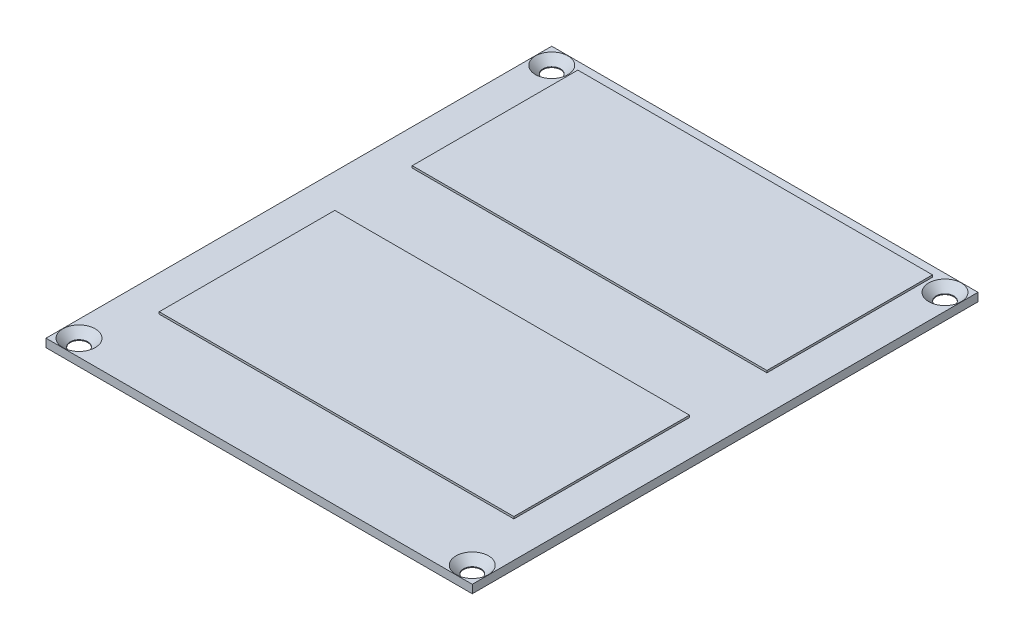
ISO-10303-21;
HEADER;
FILE_DESCRIPTION(('STEP AP214'),'2;1');
FILE_NAME('part.step','',(''),(''),'','','');
FILE_SCHEMA(('AUTOMOTIVE_DESIGN { 1 0 10303 214 1 1 1 1 }'));
ENDSEC;
DATA;
#1=APPLICATION_CONTEXT('core data for automotive mechanical design processes');
#2=APPLICATION_PROTOCOL_DEFINITION('international standard','automotive_design',2000,#1);
#3=PRODUCT_CONTEXT('',#1,'mechanical');
#4=PRODUCT('Part','Part','',(#3));
#5=PRODUCT_RELATED_PRODUCT_CATEGORY('part','',(#4));
#6=PRODUCT_DEFINITION_FORMATION('','',#4);
#7=PRODUCT_DEFINITION_CONTEXT('part definition',#1,'design');
#8=PRODUCT_DEFINITION('design','',#6,#7);
#9=PRODUCT_DEFINITION_SHAPE('','',#8);
#10=(LENGTH_UNIT() NAMED_UNIT(*) SI_UNIT(.MILLI.,.METRE.));
#11=(NAMED_UNIT(*) PLANE_ANGLE_UNIT() SI_UNIT($,.RADIAN.));
#12=(NAMED_UNIT(*) SI_UNIT($,.STERADIAN.) SOLID_ANGLE_UNIT());
#13=UNCERTAINTY_MEASURE_WITH_UNIT(LENGTH_MEASURE(1.E-05),#10,'distance_accuracy_value','');
#14=(GEOMETRIC_REPRESENTATION_CONTEXT(3) GLOBAL_UNCERTAINTY_ASSIGNED_CONTEXT((#13)) GLOBAL_UNIT_ASSIGNED_CONTEXT((#10,
#11,#12)) REPRESENTATION_CONTEXT('',''));
#15=CARTESIAN_POINT('',(0.,0.,0.));
#16=DIRECTION('',(0.,0.,1.));
#17=DIRECTION('',(1.,0.,0.));
#18=AXIS2_PLACEMENT_3D('',#15,#16,#17);
#19=CARTESIAN_POINT('',(0.,1.6,0.));
#20=DIRECTION('',(0.,1.,0.));
#21=DIRECTION('',(0.,0.,1.));
#22=AXIS2_PLACEMENT_3D('',#19,#20,#21);
#23=PLANE('',#22);
#24=CARTESIAN_POINT('',(-38.1,1.6,-45.8));
#25=DIRECTION('',(0.,1.,0.));
#26=DIRECTION('',(0.,0.,1.));
#27=AXIS2_PLACEMENT_3D('',#24,#25,#26);
#28=CIRCLE('',#27,3.15);
#29=CARTESIAN_POINT('',(-38.1,1.6,-42.65));
#30=VERTEX_POINT('',#29);
#31=EDGE_CURVE('E809',#30,#30,#28,.T.);
#32=ORIENTED_EDGE('',*,*,#31,.F.);
#33=EDGE_LOOP('',(#32));
#34=FACE_BOUND('',#33,.T.);
#35=CARTESIAN_POINT('',(38.1,1.6,-45.8));
#36=DIRECTION('',(0.,1.,0.));
#37=DIRECTION('',(0.,0.,1.));
#38=AXIS2_PLACEMENT_3D('',#35,#36,#37);
#39=CIRCLE('',#38,3.15);
#40=CARTESIAN_POINT('',(38.1,1.6,-42.65));
#41=VERTEX_POINT('',#40);
#42=EDGE_CURVE('E394',#41,#41,#39,.T.);
#43=ORIENTED_EDGE('',*,*,#42,.F.);
#44=EDGE_LOOP('',(#43));
#45=FACE_BOUND('',#44,.T.);
#46=CARTESIAN_POINT('',(38.1,1.6,45.8));
#47=DIRECTION('',(0.,1.,0.));
#48=DIRECTION('',(0.,0.,1.));
#49=AXIS2_PLACEMENT_3D('',#46,#47,#48);
#50=CIRCLE('',#49,3.15);
#51=CARTESIAN_POINT('',(38.1,1.6,48.95));
#52=VERTEX_POINT('',#51);
#53=EDGE_CURVE('E387',#52,#52,#50,.T.);
#54=ORIENTED_EDGE('',*,*,#53,.F.);
#55=EDGE_LOOP('',(#54));
#56=FACE_BOUND('',#55,.T.);
#57=CARTESIAN_POINT('',(-38.1,1.6,45.8));
#58=DIRECTION('',(0.,1.,0.));
#59=DIRECTION('',(0.,0.,1.));
#60=AXIS2_PLACEMENT_3D('',#57,#58,#59);
#61=CIRCLE('',#60,3.15);
#62=CARTESIAN_POINT('',(-38.1,1.6,48.95));
#63=VERTEX_POINT('',#62);
#64=EDGE_CURVE('E383',#63,#63,#61,.T.);
#65=ORIENTED_EDGE('',*,*,#64,.F.);
#66=EDGE_LOOP('',(#65));
#67=FACE_BOUND('',#66,.T.);
#68=DIRECTION('',(0.,0.,1.));
#69=VECTOR('',#68,1.);
#70=CARTESIAN_POINT('',(41.3,1.6,0.));
#71=LINE('',#70,#69);
#72=CARTESIAN_POINT('',(41.3,1.6,-49.));
#73=VERTEX_POINT('',#72);
#74=CARTESIAN_POINT('',(41.3,1.6,49.));
#75=VERTEX_POINT('',#74);
#76=EDGE_CURVE('E349',#73,#75,#71,.T.);
#77=ORIENTED_EDGE('',*,*,#76,.F.);
#78=DIRECTION('',(1.,0.,0.));
#79=VECTOR('',#78,1.);
#80=CARTESIAN_POINT('',(0.,1.6,-49.));
#81=LINE('',#80,#79);
#82=CARTESIAN_POINT('',(-41.3,1.6,-49.));
#83=VERTEX_POINT('',#82);
#84=EDGE_CURVE('E352',#83,#73,#81,.T.);
#85=ORIENTED_EDGE('',*,*,#84,.F.);
#86=DIRECTION('',(0.,0.,1.));
#87=VECTOR('',#86,1.);
#88=CARTESIAN_POINT('',(-41.3,1.6,0.));
#89=LINE('',#88,#87);
#90=CARTESIAN_POINT('',(-41.3,1.6,49.));
#91=VERTEX_POINT('',#90);
#92=EDGE_CURVE('E356',#83,#91,#89,.T.);
#93=ORIENTED_EDGE('',*,*,#92,.T.);
#94=DIRECTION('',(1.,0.,0.));
#95=VECTOR('',#94,1.);
#96=CARTESIAN_POINT('',(0.,1.6,49.));
#97=LINE('',#96,#95);
#98=EDGE_CURVE('E359',#91,#75,#97,.T.);
#99=ORIENTED_EDGE('',*,*,#98,.T.);
#100=EDGE_LOOP('',(#77,#85,#93,#99));
#101=FACE_BOUND('',#100,.T.);
#102=DIRECTION('',(-1.,0.,0.));
#103=VECTOR('',#102,1.);
#104=CARTESIAN_POINT('',(-34.3646542912737,1.6,-47.1195444965869));
#105=LINE('',#104,#103);
#106=CARTESIAN_POINT('',(34.3646542912737,1.6,-47.1195444965869));
#107=VERTEX_POINT('',#106);
#108=CARTESIAN_POINT('',(-34.3646542912737,1.6,-47.1195444965869));
#109=VERTEX_POINT('',#108);
#110=EDGE_CURVE('E224',#107,#109,#105,.T.);
#111=ORIENTED_EDGE('',*,*,#110,.F.);
#112=DIRECTION('',(0.,0.,-1.));
#113=VECTOR('',#112,1.);
#114=CARTESIAN_POINT('',(34.3646542912737,1.6,-47.1195444965869));
#115=LINE('',#114,#113);
#116=CARTESIAN_POINT('',(34.3646542912737,1.6,-15.0294090613042));
#117=VERTEX_POINT('',#116);
#118=EDGE_CURVE('E221',#117,#107,#115,.T.);
#119=ORIENTED_EDGE('',*,*,#118,.F.);
#120=DIRECTION('',(1.,0.,0.));
#121=VECTOR('',#120,1.);
#122=CARTESIAN_POINT('',(-34.3646542912737,1.6,-15.0294090613042));
#123=LINE('',#122,#121);
#124=CARTESIAN_POINT('',(-34.3646542912737,1.6,-15.0294090613042));
#125=VERTEX_POINT('',#124);
#126=EDGE_CURVE('E233',#125,#117,#123,.T.);
#127=ORIENTED_EDGE('',*,*,#126,.F.);
#128=DIRECTION('',(0.,0.,1.));
#129=VECTOR('',#128,1.);
#130=CARTESIAN_POINT('',(-34.3646542912737,1.6,-47.1195444965869));
#131=LINE('',#130,#129);
#132=EDGE_CURVE('E241',#109,#125,#131,.T.);
#133=ORIENTED_EDGE('',*,*,#132,.F.);
#134=EDGE_LOOP('',(#111,#119,#127,#133));
#135=FACE_BOUND('',#134,.T.);
#136=DIRECTION('',(-1.,0.,0.));
#137=VECTOR('',#136,1.);
#138=CARTESIAN_POINT('',(-34.3646542912737,1.6,-0.0294090613042267));
#139=LINE('',#138,#137);
#140=CARTESIAN_POINT('',(34.3646542912737,1.6,-0.0294090613042267));
#141=VERTEX_POINT('',#140);
#142=CARTESIAN_POINT('',(-34.3646542912737,1.6,-0.0294090613042267));
#143=VERTEX_POINT('',#142);
#144=EDGE_CURVE('E412',#141,#143,#139,.T.);
#145=ORIENTED_EDGE('',*,*,#144,.F.);
#146=DIRECTION('',(0.,0.,-1.));
#147=VECTOR('',#146,1.);
#148=CARTESIAN_POINT('',(34.3646542912737,1.6,-0.0294090613042267));
#149=LINE('',#148,#147);
#150=CARTESIAN_POINT('',(34.3646542912737,1.6,34.));
#151=VERTEX_POINT('',#150);
#152=EDGE_CURVE('E219',#151,#141,#149,.T.);
#153=ORIENTED_EDGE('',*,*,#152,.F.);
#154=DIRECTION('',(1.,0.,0.));
#155=VECTOR('',#154,1.);
#156=CARTESIAN_POINT('',(-34.3646542912737,1.6,34.));
#157=LINE('',#156,#155);
#158=CARTESIAN_POINT('',(-34.3646542912737,1.6,34.));
#159=VERTEX_POINT('',#158);
#160=EDGE_CURVE('E215',#159,#151,#157,.T.);
#161=ORIENTED_EDGE('',*,*,#160,.F.);
#162=DIRECTION('',(0.,0.,1.));
#163=VECTOR('',#162,1.);
#164=CARTESIAN_POINT('',(-34.3646542912737,1.6,-0.0294090613042267));
#165=LINE('',#164,#163);
#166=EDGE_CURVE('E414',#143,#159,#165,.T.);
#167=ORIENTED_EDGE('',*,*,#166,.F.);
#168=EDGE_LOOP('',(#145,#153,#161,#167));
#169=FACE_BOUND('',#168,.T.);
#170=ADVANCED_FACE('F33',(#34,#45,#56,#67,#101,#135,#169),#23,.T.);
#171=CARTESIAN_POINT('',(0.,0.,0.));
#172=DIRECTION('',(0.,1.,0.));
#173=DIRECTION('',(0.,0.,1.));
#174=AXIS2_PLACEMENT_3D('',#171,#172,#173);
#175=PLANE('',#174);
#176=CARTESIAN_POINT('',(-38.1,0.,-45.8));
#177=DIRECTION('',(0.,1.,0.));
#178=DIRECTION('',(0.,0.,1.));
#179=AXIS2_PLACEMENT_3D('',#176,#177,#178);
#180=CIRCLE('',#179,1.7);
#181=CARTESIAN_POINT('',(-38.1,0.,-44.1));
#182=VERTEX_POINT('',#181);
#183=EDGE_CURVE('E37',#182,#182,#180,.T.);
#184=ORIENTED_EDGE('',*,*,#183,.T.);
#185=EDGE_LOOP('',(#184));
#186=FACE_BOUND('',#185,.T.);
#187=CARTESIAN_POINT('',(38.1,0.,-45.8));
#188=DIRECTION('',(0.,1.,0.));
#189=DIRECTION('',(0.,0.,1.));
#190=AXIS2_PLACEMENT_3D('',#187,#188,#189);
#191=CIRCLE('',#190,1.7);
#192=CARTESIAN_POINT('',(38.1,0.,-44.1));
#193=VERTEX_POINT('',#192);
#194=EDGE_CURVE('E385',#193,#193,#191,.T.);
#195=ORIENTED_EDGE('',*,*,#194,.T.);
#196=EDGE_LOOP('',(#195));
#197=FACE_BOUND('',#196,.T.);
#198=CARTESIAN_POINT('',(38.1,0.,45.8));
#199=DIRECTION('',(0.,1.,0.));
#200=DIRECTION('',(0.,0.,1.));
#201=AXIS2_PLACEMENT_3D('',#198,#199,#200);
#202=CIRCLE('',#201,1.7);
#203=CARTESIAN_POINT('',(38.1,0.,47.5));
#204=VERTEX_POINT('',#203);
#205=EDGE_CURVE('E381',#204,#204,#202,.T.);
#206=ORIENTED_EDGE('',*,*,#205,.T.);
#207=EDGE_LOOP('',(#206));
#208=FACE_BOUND('',#207,.T.);
#209=CARTESIAN_POINT('',(-38.1,0.,45.8));
#210=DIRECTION('',(0.,1.,0.));
#211=DIRECTION('',(0.,0.,1.));
#212=AXIS2_PLACEMENT_3D('',#209,#210,#211);
#213=CIRCLE('',#212,1.7);
#214=CARTESIAN_POINT('',(-38.1,0.,47.5));
#215=VERTEX_POINT('',#214);
#216=EDGE_CURVE('E377',#215,#215,#213,.T.);
#217=ORIENTED_EDGE('',*,*,#216,.T.);
#218=EDGE_LOOP('',(#217));
#219=FACE_BOUND('',#218,.T.);
#220=DIRECTION('',(0.,0.,1.));
#221=VECTOR('',#220,1.);
#222=CARTESIAN_POINT('',(24.1,0.,0.));
#223=LINE('',#222,#221);
#224=CARTESIAN_POINT('',(24.1,0.,31.));
#225=VERTEX_POINT('',#224);
#226=CARTESIAN_POINT('',(24.1,0.,34.7));
#227=VERTEX_POINT('',#226);
#228=EDGE_CURVE('E276',#225,#227,#223,.T.);
#229=ORIENTED_EDGE('',*,*,#228,.F.);
#230=DIRECTION('',(1.,0.,0.));
#231=VECTOR('',#230,1.);
#232=CARTESIAN_POINT('',(0.,0.,31.));
#233=LINE('',#232,#231);
#234=CARTESIAN_POINT('',(8.51084598698482,0.,31.));
#235=VERTEX_POINT('',#234);
#236=EDGE_CURVE('E299',#235,#225,#233,.T.);
#237=ORIENTED_EDGE('',*,*,#236,.F.);
#238=DIRECTION('',(0.,0.,1.));
#239=VECTOR('',#238,1.);
#240=CARTESIAN_POINT('',(8.51084598698482,0.,0.));
#241=LINE('',#240,#239);
#242=CARTESIAN_POINT('',(8.51084598698482,0.,34.7));
#243=VERTEX_POINT('',#242);
#244=EDGE_CURVE('E302',#235,#243,#241,.T.);
#245=ORIENTED_EDGE('',*,*,#244,.T.);
#246=DIRECTION('',(1.,0.,0.));
#247=VECTOR('',#246,1.);
#248=CARTESIAN_POINT('',(0.,0.,34.7));
#249=LINE('',#248,#247);
#250=EDGE_CURVE('E288',#243,#227,#249,.T.);
#251=ORIENTED_EDGE('',*,*,#250,.T.);
#252=EDGE_LOOP('',(#229,#237,#245,#251));
#253=FACE_BOUND('',#252,.T.);
#254=DIRECTION('',(0.,0.,1.));
#255=VECTOR('',#254,1.);
#256=CARTESIAN_POINT('',(41.3,0.,0.));
#257=LINE('',#256,#255);
#258=CARTESIAN_POINT('',(41.3,0.,-49.));
#259=VERTEX_POINT('',#258);
#260=CARTESIAN_POINT('',(41.3,0.,49.));
#261=VERTEX_POINT('',#260);
#262=EDGE_CURVE('E340',#259,#261,#257,.T.);
#263=ORIENTED_EDGE('',*,*,#262,.T.);
#264=DIRECTION('',(1.,0.,0.));
#265=VECTOR('',#264,1.);
#266=CARTESIAN_POINT('',(0.,0.,49.));
#267=LINE('',#266,#265);
#268=CARTESIAN_POINT('',(-41.3,0.,49.));
#269=VERTEX_POINT('',#268);
#270=EDGE_CURVE('E353',#269,#261,#267,.T.);
#271=ORIENTED_EDGE('',*,*,#270,.F.);
#272=DIRECTION('',(0.,0.,1.));
#273=VECTOR('',#272,1.);
#274=CARTESIAN_POINT('',(-41.3,0.,0.));
#275=LINE('',#274,#273);
#276=CARTESIAN_POINT('',(-41.3,0.,-49.));
#277=VERTEX_POINT('',#276);
#278=EDGE_CURVE('E367',#277,#269,#275,.T.);
#279=ORIENTED_EDGE('',*,*,#278,.F.);
#280=DIRECTION('',(1.,0.,0.));
#281=VECTOR('',#280,1.);
#282=CARTESIAN_POINT('',(0.,0.,-49.));
#283=LINE('',#282,#281);
#284=EDGE_CURVE('E364',#277,#259,#283,.T.);
#285=ORIENTED_EDGE('',*,*,#284,.T.);
#286=EDGE_LOOP('',(#263,#271,#279,#285));
#287=FACE_BOUND('',#286,.T.);
#288=DIRECTION('',(0.,0.,1.));
#289=VECTOR('',#288,1.);
#290=CARTESIAN_POINT('',(24.1,0.,0.));
#291=LINE('',#290,#289);
#292=CARTESIAN_POINT('',(24.1,0.,36.2));
#293=VERTEX_POINT('',#292);
#294=CARTESIAN_POINT('',(24.1,0.,39.9));
#295=VERTEX_POINT('',#294);
#296=EDGE_CURVE('E308',#293,#295,#291,.T.);
#297=ORIENTED_EDGE('',*,*,#296,.F.);
#298=DIRECTION('',(1.,0.,0.));
#299=VECTOR('',#298,1.);
#300=CARTESIAN_POINT('',(0.,0.,36.2));
#301=LINE('',#300,#299);
#302=CARTESIAN_POINT('',(6.42733188720174,0.,36.2));
#303=VERTEX_POINT('',#302);
#304=EDGE_CURVE('E331',#303,#293,#301,.T.);
#305=ORIENTED_EDGE('',*,*,#304,.F.);
#306=DIRECTION('',(0.,0.,1.));
#307=VECTOR('',#306,1.);
#308=CARTESIAN_POINT('',(6.42733188720174,0.,0.));
#309=LINE('',#308,#307);
#310=CARTESIAN_POINT('',(6.42733188720174,0.,39.9));
#311=VERTEX_POINT('',#310);
#312=EDGE_CURVE('E334',#303,#311,#309,.T.);
#313=ORIENTED_EDGE('',*,*,#312,.T.);
#314=DIRECTION('',(1.,0.,0.));
#315=VECTOR('',#314,1.);
#316=CARTESIAN_POINT('',(0.,0.,39.9));
#317=LINE('',#316,#315);
#318=EDGE_CURVE('E320',#311,#295,#317,.T.);
#319=ORIENTED_EDGE('',*,*,#318,.T.);
#320=EDGE_LOOP('',(#297,#305,#313,#319));
#321=FACE_BOUND('',#320,.T.);
#322=DIRECTION('',(0.,0.,1.));
#323=VECTOR('',#322,1.);
#324=CARTESIAN_POINT('',(4.92733188720173,0.,0.));
#325=LINE('',#324,#323);
#326=CARTESIAN_POINT('',(4.92733188720174,0.,36.2));
#327=VERTEX_POINT('',#326);
#328=CARTESIAN_POINT('',(4.92733188720174,0.,39.9));
#329=VERTEX_POINT('',#328);
#330=EDGE_CURVE('E252',#327,#329,#325,.T.);
#331=ORIENTED_EDGE('',*,*,#330,.F.);
#332=DIRECTION('',(1.,0.,0.));
#333=VECTOR('',#332,1.);
#334=CARTESIAN_POINT('',(0.,0.,36.2));
#335=LINE('',#334,#333);
#336=CARTESIAN_POINT('',(-14.8726681127983,0.,36.2));
#337=VERTEX_POINT('',#336);
#338=EDGE_CURVE('E267',#337,#327,#335,.T.);
#339=ORIENTED_EDGE('',*,*,#338,.F.);
#340=DIRECTION('',(0.,0.,1.));
#341=VECTOR('',#340,1.);
#342=CARTESIAN_POINT('',(-14.8726681127983,0.,0.));
#343=LINE('',#342,#341);
#344=CARTESIAN_POINT('',(-14.8726681127983,0.,39.9));
#345=VERTEX_POINT('',#344);
#346=EDGE_CURVE('E270',#337,#345,#343,.T.);
#347=ORIENTED_EDGE('',*,*,#346,.T.);
#348=DIRECTION('',(1.,0.,0.));
#349=VECTOR('',#348,1.);
#350=CARTESIAN_POINT('',(0.,0.,39.9));
#351=LINE('',#350,#349);
#352=EDGE_CURVE('E256',#345,#329,#351,.T.);
#353=ORIENTED_EDGE('',*,*,#352,.T.);
#354=EDGE_LOOP('',(#331,#339,#347,#353));
#355=FACE_BOUND('',#354,.T.);
#356=ADVANCED_FACE('F433',(#186,#197,#208,#219,#253,#287,#321,#355),#175,.F.);
#357=CARTESIAN_POINT('',(41.3,1.6,0.));
#358=DIRECTION('',(1.,0.,0.));
#359=DIRECTION('',(0.,0.,-1.));
#360=AXIS2_PLACEMENT_3D('',#357,#358,#359);
#361=PLANE('',#360);
#362=ORIENTED_EDGE('',*,*,#262,.F.);
#363=DIRECTION('',(0.,-1.,0.));
#364=VECTOR('',#363,1.);
#365=CARTESIAN_POINT('',(41.3,1.6,-49.));
#366=LINE('',#365,#364);
#367=EDGE_CURVE('E11',#73,#259,#366,.T.);
#368=ORIENTED_EDGE('',*,*,#367,.F.);
#369=ORIENTED_EDGE('',*,*,#76,.T.);
#370=DIRECTION('',(0.,-1.,0.));
#371=VECTOR('',#370,1.);
#372=CARTESIAN_POINT('',(41.3,1.6,49.));
#373=LINE('',#372,#371);
#374=EDGE_CURVE('E361',#75,#261,#373,.T.);
#375=ORIENTED_EDGE('',*,*,#374,.T.);
#376=EDGE_LOOP('',(#362,#368,#369,#375));
#377=FACE_BOUND('',#376,.T.);
#378=ADVANCED_FACE('F35',(#377),#361,.T.);
#379=CARTESIAN_POINT('',(0.,1.6,-49.));
#380=DIRECTION('',(0.,0.,-1.));
#381=DIRECTION('',(-1.,0.,0.));
#382=AXIS2_PLACEMENT_3D('',#379,#380,#381);
#383=PLANE('',#382);
#384=ORIENTED_EDGE('',*,*,#284,.F.);
#385=DIRECTION('',(0.,-1.,0.));
#386=VECTOR('',#385,1.);
#387=CARTESIAN_POINT('',(-41.3,1.6,-49.));
#388=LINE('',#387,#386);
#389=EDGE_CURVE('E42',#83,#277,#388,.T.);
#390=ORIENTED_EDGE('',*,*,#389,.F.);
#391=ORIENTED_EDGE('',*,*,#84,.T.);
#392=ORIENTED_EDGE('',*,*,#367,.T.);
#393=EDGE_LOOP('',(#384,#390,#391,#392));
#394=FACE_BOUND('',#393,.T.);
#395=ADVANCED_FACE('F454',(#394),#383,.T.);
#396=CARTESIAN_POINT('',(-41.3,1.6,0.));
#397=DIRECTION('',(1.,0.,0.));
#398=DIRECTION('',(0.,0.,-1.));
#399=AXIS2_PLACEMENT_3D('',#396,#397,#398);
#400=PLANE('',#399);
#401=ORIENTED_EDGE('',*,*,#278,.T.);
#402=DIRECTION('',(0.,-1.,0.));
#403=VECTOR('',#402,1.);
#404=CARTESIAN_POINT('',(-41.3,1.6,49.));
#405=LINE('',#404,#403);
#406=EDGE_CURVE('E373',#91,#269,#405,.T.);
#407=ORIENTED_EDGE('',*,*,#406,.F.);
#408=ORIENTED_EDGE('',*,*,#92,.F.);
#409=ORIENTED_EDGE('',*,*,#389,.T.);
#410=EDGE_LOOP('',(#401,#407,#408,#409));
#411=FACE_BOUND('',#410,.T.);
#412=ADVANCED_FACE('F451',(#411),#400,.F.);
#413=CARTESIAN_POINT('',(0.,1.6,49.));
#414=DIRECTION('',(0.,0.,-1.));
#415=DIRECTION('',(-1.,0.,0.));
#416=AXIS2_PLACEMENT_3D('',#413,#414,#415);
#417=PLANE('',#416);
#418=ORIENTED_EDGE('',*,*,#270,.T.);
#419=ORIENTED_EDGE('',*,*,#374,.F.);
#420=ORIENTED_EDGE('',*,*,#98,.F.);
#421=ORIENTED_EDGE('',*,*,#406,.T.);
#422=EDGE_LOOP('',(#418,#419,#420,#421));
#423=FACE_BOUND('',#422,.T.);
#424=ADVANCED_FACE('F448',(#423),#417,.F.);
#425=CARTESIAN_POINT('',(24.1,-1.6,0.));
#426=DIRECTION('',(-1.,0.,0.));
#427=DIRECTION('',(0.,0.,1.));
#428=AXIS2_PLACEMENT_3D('',#425,#426,#427);
#429=PLANE('',#428);
#430=ORIENTED_EDGE('',*,*,#296,.T.);
#431=DIRECTION('',(0.,1.,0.));
#432=VECTOR('',#431,1.);
#433=CARTESIAN_POINT('',(24.1,-1.6,39.9));
#434=LINE('',#433,#432);
#435=CARTESIAN_POINT('',(24.1,-1.6,39.9));
#436=VERTEX_POINT('',#435);
#437=EDGE_CURVE('E337',#436,#295,#434,.T.);
#438=ORIENTED_EDGE('',*,*,#437,.F.);
#439=DIRECTION('',(0.,0.,1.));
#440=VECTOR('',#439,1.);
#441=CARTESIAN_POINT('',(24.1,-1.6,0.));
#442=LINE('',#441,#440);
#443=CARTESIAN_POINT('',(24.1,-1.6,36.2));
#444=VERTEX_POINT('',#443);
#445=EDGE_CURVE('E317',#444,#436,#442,.T.);
#446=ORIENTED_EDGE('',*,*,#445,.F.);
#447=DIRECTION('',(0.,1.,0.));
#448=VECTOR('',#447,1.);
#449=CARTESIAN_POINT('',(24.1,-1.6,36.2));
#450=LINE('',#449,#448);
#451=EDGE_CURVE('E328',#444,#293,#450,.T.);
#452=ORIENTED_EDGE('',*,*,#451,.T.);
#453=EDGE_LOOP('',(#430,#438,#446,#452));
#454=FACE_BOUND('',#453,.T.);
#455=ADVANCED_FACE('F445',(#454),#429,.F.);
#456=CARTESIAN_POINT('',(0.,-1.6,39.9));
#457=DIRECTION('',(0.,0.,1.));
#458=DIRECTION('',(1.,0.,0.));
#459=AXIS2_PLACEMENT_3D('',#456,#457,#458);
#460=PLANE('',#459);
#461=ORIENTED_EDGE('',*,*,#318,.F.);
#462=DIRECTION('',(0.,1.,0.));
#463=VECTOR('',#462,1.);
#464=CARTESIAN_POINT('',(6.42733188720174,-1.6,39.9));
#465=LINE('',#464,#463);
#466=CARTESIAN_POINT('',(6.42733188720174,-1.6,39.9));
#467=VERTEX_POINT('',#466);
#468=EDGE_CURVE('E341',#467,#311,#465,.T.);
#469=ORIENTED_EDGE('',*,*,#468,.F.);
#470=DIRECTION('',(1.,0.,0.));
#471=VECTOR('',#470,1.);
#472=CARTESIAN_POINT('',(0.,-1.6,39.9));
#473=LINE('',#472,#471);
#474=EDGE_CURVE('E325',#467,#436,#473,.T.);
#475=ORIENTED_EDGE('',*,*,#474,.T.);
#476=ORIENTED_EDGE('',*,*,#437,.T.);
#477=EDGE_LOOP('',(#461,#469,#475,#476));
#478=FACE_BOUND('',#477,.T.);
#479=ADVANCED_FACE('F551',(#478),#460,.T.);
#480=CARTESIAN_POINT('',(6.42733188720174,-1.6,0.));
#481=DIRECTION('',(-1.,0.,0.));
#482=DIRECTION('',(0.,0.,1.));
#483=AXIS2_PLACEMENT_3D('',#480,#481,#482);
#484=PLANE('',#483);
#485=ORIENTED_EDGE('',*,*,#312,.F.);
#486=DIRECTION('',(0.,1.,0.));
#487=VECTOR('',#486,1.);
#488=CARTESIAN_POINT('',(6.42733188720174,-1.6,36.2));
#489=LINE('',#488,#487);
#490=CARTESIAN_POINT('',(6.42733188720174,-1.6,36.2));
#491=VERTEX_POINT('',#490);
#492=EDGE_CURVE('E344',#491,#303,#489,.T.);
#493=ORIENTED_EDGE('',*,*,#492,.F.);
#494=DIRECTION('',(0.,0.,1.));
#495=VECTOR('',#494,1.);
#496=CARTESIAN_POINT('',(6.42733188720174,-1.6,0.));
#497=LINE('',#496,#495);
#498=EDGE_CURVE('E322',#491,#467,#497,.T.);
#499=ORIENTED_EDGE('',*,*,#498,.T.);
#500=ORIENTED_EDGE('',*,*,#468,.T.);
#501=EDGE_LOOP('',(#485,#493,#499,#500));
#502=FACE_BOUND('',#501,.T.);
#503=ADVANCED_FACE('F554',(#502),#484,.T.);
#504=CARTESIAN_POINT('',(0.,-1.6,36.2));
#505=DIRECTION('',(0.,0.,1.));
#506=DIRECTION('',(1.,0.,0.));
#507=AXIS2_PLACEMENT_3D('',#504,#505,#506);
#508=PLANE('',#507);
#509=ORIENTED_EDGE('',*,*,#304,.T.);
#510=ORIENTED_EDGE('',*,*,#451,.F.);
#511=DIRECTION('',(1.,0.,0.));
#512=VECTOR('',#511,1.);
#513=CARTESIAN_POINT('',(0.,-1.6,36.2));
#514=LINE('',#513,#512);
#515=EDGE_CURVE('E319',#491,#444,#514,.T.);
#516=ORIENTED_EDGE('',*,*,#515,.F.);
#517=ORIENTED_EDGE('',*,*,#492,.T.);
#518=EDGE_LOOP('',(#509,#510,#516,#517));
#519=FACE_BOUND('',#518,.T.);
#520=ADVANCED_FACE('F549',(#519),#508,.F.);
#521=CARTESIAN_POINT('',(0.,-1.6,0.));
#522=DIRECTION('',(0.,1.,0.));
#523=DIRECTION('',(0.,0.,1.));
#524=AXIS2_PLACEMENT_3D('',#521,#522,#523);
#525=PLANE('',#524);
#526=ORIENTED_EDGE('',*,*,#445,.T.);
#527=ORIENTED_EDGE('',*,*,#474,.F.);
#528=ORIENTED_EDGE('',*,*,#498,.F.);
#529=ORIENTED_EDGE('',*,*,#515,.T.);
#530=EDGE_LOOP('',(#526,#527,#528,#529));
#531=FACE_BOUND('',#530,.T.);
#532=ADVANCED_FACE('F545',(#531),#525,.F.);
#533=CARTESIAN_POINT('',(24.1,-1.6,0.));
#534=DIRECTION('',(-1.,0.,0.));
#535=DIRECTION('',(0.,0.,1.));
#536=AXIS2_PLACEMENT_3D('',#533,#534,#535);
#537=PLANE('',#536);
#538=ORIENTED_EDGE('',*,*,#228,.T.);
#539=DIRECTION('',(0.,1.,0.));
#540=VECTOR('',#539,1.);
#541=CARTESIAN_POINT('',(24.1,-1.6,34.7));
#542=LINE('',#541,#540);
#543=CARTESIAN_POINT('',(24.1,-1.6,34.7));
#544=VERTEX_POINT('',#543);
#545=EDGE_CURVE('E305',#544,#227,#542,.T.);
#546=ORIENTED_EDGE('',*,*,#545,.F.);
#547=DIRECTION('',(0.,0.,1.));
#548=VECTOR('',#547,1.);
#549=CARTESIAN_POINT('',(24.1,-1.6,0.));
#550=LINE('',#549,#548);
#551=CARTESIAN_POINT('',(24.1,-1.6,31.));
#552=VERTEX_POINT('',#551);
#553=EDGE_CURVE('E285',#552,#544,#550,.T.);
#554=ORIENTED_EDGE('',*,*,#553,.F.);
#555=DIRECTION('',(0.,1.,0.));
#556=VECTOR('',#555,1.);
#557=CARTESIAN_POINT('',(24.1,-1.6,31.));
#558=LINE('',#557,#556);
#559=EDGE_CURVE('E296',#552,#225,#558,.T.);
#560=ORIENTED_EDGE('',*,*,#559,.T.);
#561=EDGE_LOOP('',(#538,#546,#554,#560));
#562=FACE_BOUND('',#561,.T.);
#563=ADVANCED_FACE('F535',(#562),#537,.F.);
#564=CARTESIAN_POINT('',(0.,-1.6,34.7));
#565=DIRECTION('',(0.,0.,1.));
#566=DIRECTION('',(1.,0.,0.));
#567=AXIS2_PLACEMENT_3D('',#564,#565,#566);
#568=PLANE('',#567);
#569=ORIENTED_EDGE('',*,*,#250,.F.);
#570=DIRECTION('',(0.,1.,0.));
#571=VECTOR('',#570,1.);
#572=CARTESIAN_POINT('',(8.51084598698482,-1.6,34.7));
#573=LINE('',#572,#571);
#574=CARTESIAN_POINT('',(8.51084598698482,-1.6,34.7));
#575=VERTEX_POINT('',#574);
#576=EDGE_CURVE('E309',#575,#243,#573,.T.);
#577=ORIENTED_EDGE('',*,*,#576,.F.);
#578=DIRECTION('',(1.,0.,0.));
#579=VECTOR('',#578,1.);
#580=CARTESIAN_POINT('',(0.,-1.6,34.7));
#581=LINE('',#580,#579);
#582=EDGE_CURVE('E293',#575,#544,#581,.T.);
#583=ORIENTED_EDGE('',*,*,#582,.T.);
#584=ORIENTED_EDGE('',*,*,#545,.T.);
#585=EDGE_LOOP('',(#569,#577,#583,#584));
#586=FACE_BOUND('',#585,.T.);
#587=ADVANCED_FACE('F531',(#586),#568,.T.);
#588=CARTESIAN_POINT('',(8.51084598698482,-1.6,0.));
#589=DIRECTION('',(-1.,0.,0.));
#590=DIRECTION('',(0.,0.,1.));
#591=AXIS2_PLACEMENT_3D('',#588,#589,#590);
#592=PLANE('',#591);
#593=ORIENTED_EDGE('',*,*,#244,.F.);
#594=DIRECTION('',(0.,1.,0.));
#595=VECTOR('',#594,1.);
#596=CARTESIAN_POINT('',(8.51084598698482,-1.6,31.));
#597=LINE('',#596,#595);
#598=CARTESIAN_POINT('',(8.51084598698482,-1.6,31.));
#599=VERTEX_POINT('',#598);
#600=EDGE_CURVE('E312',#599,#235,#597,.T.);
#601=ORIENTED_EDGE('',*,*,#600,.F.);
#602=DIRECTION('',(0.,0.,1.));
#603=VECTOR('',#602,1.);
#604=CARTESIAN_POINT('',(8.51084598698482,-1.6,0.));
#605=LINE('',#604,#603);
#606=EDGE_CURVE('E290',#599,#575,#605,.T.);
#607=ORIENTED_EDGE('',*,*,#606,.T.);
#608=ORIENTED_EDGE('',*,*,#576,.T.);
#609=EDGE_LOOP('',(#593,#601,#607,#608));
#610=FACE_BOUND('',#609,.T.);
#611=ADVANCED_FACE('F534',(#610),#592,.T.);
#612=CARTESIAN_POINT('',(0.,-1.6,31.));
#613=DIRECTION('',(0.,0.,1.));
#614=DIRECTION('',(1.,0.,0.));
#615=AXIS2_PLACEMENT_3D('',#612,#613,#614);
#616=PLANE('',#615);
#617=ORIENTED_EDGE('',*,*,#236,.T.);
#618=ORIENTED_EDGE('',*,*,#559,.F.);
#619=DIRECTION('',(1.,0.,0.));
#620=VECTOR('',#619,1.);
#621=CARTESIAN_POINT('',(0.,-1.6,31.));
#622=LINE('',#621,#620);
#623=EDGE_CURVE('E287',#599,#552,#622,.T.);
#624=ORIENTED_EDGE('',*,*,#623,.F.);
#625=ORIENTED_EDGE('',*,*,#600,.T.);
#626=EDGE_LOOP('',(#617,#618,#624,#625));
#627=FACE_BOUND('',#626,.T.);
#628=ADVANCED_FACE('F529',(#627),#616,.F.);
#629=CARTESIAN_POINT('',(0.,-1.6,0.));
#630=DIRECTION('',(0.,1.,0.));
#631=DIRECTION('',(0.,0.,1.));
#632=AXIS2_PLACEMENT_3D('',#629,#630,#631);
#633=PLANE('',#632);
#634=ORIENTED_EDGE('',*,*,#553,.T.);
#635=ORIENTED_EDGE('',*,*,#582,.F.);
#636=ORIENTED_EDGE('',*,*,#606,.F.);
#637=ORIENTED_EDGE('',*,*,#623,.T.);
#638=EDGE_LOOP('',(#634,#635,#636,#637));
#639=FACE_BOUND('',#638,.T.);
#640=ADVANCED_FACE('F525',(#639),#633,.F.);
#641=CARTESIAN_POINT('',(4.92733188720173,-1.6,0.));
#642=DIRECTION('',(-1.,0.,0.));
#643=DIRECTION('',(0.,0.,1.));
#644=AXIS2_PLACEMENT_3D('',#641,#642,#643);
#645=PLANE('',#644);
#646=ORIENTED_EDGE('',*,*,#330,.T.);
#647=DIRECTION('',(0.,1.,0.));
#648=VECTOR('',#647,1.);
#649=CARTESIAN_POINT('',(4.92733188720174,-1.6,39.9));
#650=LINE('',#649,#648);
#651=CARTESIAN_POINT('',(4.92733188720174,-1.6,39.9));
#652=VERTEX_POINT('',#651);
#653=EDGE_CURVE('E273',#652,#329,#650,.T.);
#654=ORIENTED_EDGE('',*,*,#653,.F.);
#655=DIRECTION('',(0.,0.,1.));
#656=VECTOR('',#655,1.);
#657=CARTESIAN_POINT('',(4.92733188720173,-1.6,0.));
#658=LINE('',#657,#656);
#659=CARTESIAN_POINT('',(4.92733188720174,-1.6,36.2));
#660=VERTEX_POINT('',#659);
#661=EDGE_CURVE('E253',#660,#652,#658,.T.);
#662=ORIENTED_EDGE('',*,*,#661,.F.);
#663=DIRECTION('',(0.,1.,0.));
#664=VECTOR('',#663,1.);
#665=CARTESIAN_POINT('',(4.92733188720174,-1.6,36.2));
#666=LINE('',#665,#664);
#667=EDGE_CURVE('E264',#660,#327,#666,.T.);
#668=ORIENTED_EDGE('',*,*,#667,.T.);
#669=EDGE_LOOP('',(#646,#654,#662,#668));
#670=FACE_BOUND('',#669,.T.);
#671=ADVANCED_FACE('F515',(#670),#645,.F.);
#672=CARTESIAN_POINT('',(0.,-1.6,39.9));
#673=DIRECTION('',(0.,0.,1.));
#674=DIRECTION('',(1.,0.,0.));
#675=AXIS2_PLACEMENT_3D('',#672,#673,#674);
#676=PLANE('',#675);
#677=ORIENTED_EDGE('',*,*,#352,.F.);
#678=DIRECTION('',(0.,1.,0.));
#679=VECTOR('',#678,1.);
#680=CARTESIAN_POINT('',(-14.8726681127983,-1.6,39.9));
#681=LINE('',#680,#679);
#682=CARTESIAN_POINT('',(-14.8726681127983,-1.6,39.9));
#683=VERTEX_POINT('',#682);
#684=EDGE_CURVE('E277',#683,#345,#681,.T.);
#685=ORIENTED_EDGE('',*,*,#684,.F.);
#686=DIRECTION('',(1.,0.,0.));
#687=VECTOR('',#686,1.);
#688=CARTESIAN_POINT('',(0.,-1.6,39.9));
#689=LINE('',#688,#687);
#690=EDGE_CURVE('E261',#683,#652,#689,.T.);
#691=ORIENTED_EDGE('',*,*,#690,.T.);
#692=ORIENTED_EDGE('',*,*,#653,.T.);
#693=EDGE_LOOP('',(#677,#685,#691,#692));
#694=FACE_BOUND('',#693,.T.);
#695=ADVANCED_FACE('F511',(#694),#676,.T.);
#696=CARTESIAN_POINT('',(-14.8726681127983,-1.6,0.));
#697=DIRECTION('',(-1.,0.,0.));
#698=DIRECTION('',(0.,0.,1.));
#699=AXIS2_PLACEMENT_3D('',#696,#697,#698);
#700=PLANE('',#699);
#701=ORIENTED_EDGE('',*,*,#346,.F.);
#702=DIRECTION('',(0.,1.,0.));
#703=VECTOR('',#702,1.);
#704=CARTESIAN_POINT('',(-14.8726681127983,-1.6,36.2));
#705=LINE('',#704,#703);
#706=CARTESIAN_POINT('',(-14.8726681127983,-1.6,36.2));
#707=VERTEX_POINT('',#706);
#708=EDGE_CURVE('E280',#707,#337,#705,.T.);
#709=ORIENTED_EDGE('',*,*,#708,.F.);
#710=DIRECTION('',(0.,0.,1.));
#711=VECTOR('',#710,1.);
#712=CARTESIAN_POINT('',(-14.8726681127983,-1.6,0.));
#713=LINE('',#712,#711);
#714=EDGE_CURVE('E258',#707,#683,#713,.T.);
#715=ORIENTED_EDGE('',*,*,#714,.T.);
#716=ORIENTED_EDGE('',*,*,#684,.T.);
#717=EDGE_LOOP('',(#701,#709,#715,#716));
#718=FACE_BOUND('',#717,.T.);
#719=ADVANCED_FACE('F514',(#718),#700,.T.);
#720=CARTESIAN_POINT('',(0.,-1.6,36.2));
#721=DIRECTION('',(0.,0.,1.));
#722=DIRECTION('',(1.,0.,0.));
#723=AXIS2_PLACEMENT_3D('',#720,#721,#722);
#724=PLANE('',#723);
#725=ORIENTED_EDGE('',*,*,#338,.T.);
#726=ORIENTED_EDGE('',*,*,#667,.F.);
#727=DIRECTION('',(1.,0.,0.));
#728=VECTOR('',#727,1.);
#729=CARTESIAN_POINT('',(0.,-1.6,36.2));
#730=LINE('',#729,#728);
#731=EDGE_CURVE('E255',#707,#660,#730,.T.);
#732=ORIENTED_EDGE('',*,*,#731,.F.);
#733=ORIENTED_EDGE('',*,*,#708,.T.);
#734=EDGE_LOOP('',(#725,#726,#732,#733));
#735=FACE_BOUND('',#734,.T.);
#736=ADVANCED_FACE('F509',(#735),#724,.F.);
#737=CARTESIAN_POINT('',(0.,-1.6,0.));
#738=DIRECTION('',(0.,1.,0.));
#739=DIRECTION('',(0.,0.,1.));
#740=AXIS2_PLACEMENT_3D('',#737,#738,#739);
#741=PLANE('',#740);
#742=ORIENTED_EDGE('',*,*,#661,.T.);
#743=ORIENTED_EDGE('',*,*,#690,.F.);
#744=ORIENTED_EDGE('',*,*,#714,.F.);
#745=ORIENTED_EDGE('',*,*,#731,.T.);
#746=EDGE_LOOP('',(#742,#743,#744,#745));
#747=FACE_BOUND('',#746,.T.);
#748=ADVANCED_FACE('F506',(#747),#741,.F.);
#749=CARTESIAN_POINT('',(34.3646542912737,2.,-47.1195444965869));
#750=DIRECTION('',(-1.,0.,0.));
#751=DIRECTION('',(0.,0.,1.));
#752=AXIS2_PLACEMENT_3D('',#749,#750,#751);
#753=PLANE('',#752);
#754=ORIENTED_EDGE('',*,*,#118,.T.);
#755=DIRECTION('',(0.,-1.,0.));
#756=VECTOR('',#755,1.);
#757=CARTESIAN_POINT('',(34.3646542912737,2.,-47.1195444965869));
#758=LINE('',#757,#756);
#759=CARTESIAN_POINT('',(34.3646542912737,2.,-47.1195444965869));
#760=VERTEX_POINT('',#759);
#761=EDGE_CURVE('E250',#760,#107,#758,.T.);
#762=ORIENTED_EDGE('',*,*,#761,.F.);
#763=DIRECTION('',(0.,0.,-1.));
#764=VECTOR('',#763,1.);
#765=CARTESIAN_POINT('',(34.3646542912737,2.,-47.1195444965869));
#766=LINE('',#765,#764);
#767=CARTESIAN_POINT('',(34.3646542912737,2.,-15.0294090613042));
#768=VERTEX_POINT('',#767);
#769=EDGE_CURVE('E229',#768,#760,#766,.T.);
#770=ORIENTED_EDGE('',*,*,#769,.F.);
#771=DIRECTION('',(0.,-1.,0.));
#772=VECTOR('',#771,1.);
#773=CARTESIAN_POINT('',(34.3646542912737,2.,-15.0294090613042));
#774=LINE('',#773,#772);
#775=EDGE_CURVE('E238',#768,#117,#774,.T.);
#776=ORIENTED_EDGE('',*,*,#775,.T.);
#777=EDGE_LOOP('',(#754,#762,#770,#776));
#778=FACE_BOUND('',#777,.T.);
#779=ADVANCED_FACE('F490',(#778),#753,.F.);
#780=CARTESIAN_POINT('',(-34.3646542912737,2.,-47.1195444965869));
#781=DIRECTION('',(0.,0.,1.));
#782=DIRECTION('',(1.,0.,0.));
#783=AXIS2_PLACEMENT_3D('',#780,#781,#782);
#784=PLANE('',#783);
#785=ORIENTED_EDGE('',*,*,#110,.T.);
#786=DIRECTION('',(0.,-1.,0.));
#787=VECTOR('',#786,1.);
#788=CARTESIAN_POINT('',(-34.3646542912737,2.,-47.1195444965869));
#789=LINE('',#788,#787);
#790=CARTESIAN_POINT('',(-34.3646542912737,2.,-47.1195444965869));
#791=VERTEX_POINT('',#790);
#792=EDGE_CURVE('E247',#791,#109,#789,.T.);
#793=ORIENTED_EDGE('',*,*,#792,.F.);
#794=DIRECTION('',(-1.,0.,0.));
#795=VECTOR('',#794,1.);
#796=CARTESIAN_POINT('',(-34.3646542912737,2.,-47.1195444965869));
#797=LINE('',#796,#795);
#798=EDGE_CURVE('E232',#760,#791,#797,.T.);
#799=ORIENTED_EDGE('',*,*,#798,.F.);
#800=ORIENTED_EDGE('',*,*,#761,.T.);
#801=EDGE_LOOP('',(#785,#793,#799,#800));
#802=FACE_BOUND('',#801,.T.);
#803=ADVANCED_FACE('F480',(#802),#784,.F.);
#804=CARTESIAN_POINT('',(-34.3646542912737,2.,-47.1195444965869));
#805=DIRECTION('',(1.,0.,0.));
#806=DIRECTION('',(0.,0.,-1.));
#807=AXIS2_PLACEMENT_3D('',#804,#805,#806);
#808=PLANE('',#807);
#809=ORIENTED_EDGE('',*,*,#132,.T.);
#810=DIRECTION('',(0.,-1.,0.));
#811=VECTOR('',#810,1.);
#812=CARTESIAN_POINT('',(-34.3646542912737,2.,-15.0294090613042));
#813=LINE('',#812,#811);
#814=CARTESIAN_POINT('',(-34.3646542912737,2.,-15.0294090613042));
#815=VERTEX_POINT('',#814);
#816=EDGE_CURVE('E58',#815,#125,#813,.T.);
#817=ORIENTED_EDGE('',*,*,#816,.F.);
#818=DIRECTION('',(0.,0.,1.));
#819=VECTOR('',#818,1.);
#820=CARTESIAN_POINT('',(-34.3646542912737,2.,-47.1195444965869));
#821=LINE('',#820,#819);
#822=EDGE_CURVE('E235',#791,#815,#821,.T.);
#823=ORIENTED_EDGE('',*,*,#822,.F.);
#824=ORIENTED_EDGE('',*,*,#792,.T.);
#825=EDGE_LOOP('',(#809,#817,#823,#824));
#826=FACE_BOUND('',#825,.T.);
#827=ADVANCED_FACE('F484',(#826),#808,.F.);
#828=CARTESIAN_POINT('',(-34.3646542912737,2.,-15.0294090613042));
#829=DIRECTION('',(0.,0.,-1.));
#830=DIRECTION('',(-1.,0.,0.));
#831=AXIS2_PLACEMENT_3D('',#828,#829,#830);
#832=PLANE('',#831);
#833=ORIENTED_EDGE('',*,*,#126,.T.);
#834=ORIENTED_EDGE('',*,*,#775,.F.);
#835=DIRECTION('',(1.,0.,0.));
#836=VECTOR('',#835,1.);
#837=CARTESIAN_POINT('',(-34.3646542912737,2.,-15.0294090613042));
#838=LINE('',#837,#836);
#839=EDGE_CURVE('E237',#815,#768,#838,.T.);
#840=ORIENTED_EDGE('',*,*,#839,.F.);
#841=ORIENTED_EDGE('',*,*,#816,.T.);
#842=EDGE_LOOP('',(#833,#834,#840,#841));
#843=FACE_BOUND('',#842,.T.);
#844=ADVANCED_FACE('F491',(#843),#832,.F.);
#845=CARTESIAN_POINT('',(0.,2.,0.));
#846=DIRECTION('',(0.,1.,0.));
#847=DIRECTION('',(0.,0.,1.));
#848=AXIS2_PLACEMENT_3D('',#845,#846,#847);
#849=PLANE('',#848);
#850=ORIENTED_EDGE('',*,*,#769,.T.);
#851=ORIENTED_EDGE('',*,*,#798,.T.);
#852=ORIENTED_EDGE('',*,*,#822,.T.);
#853=ORIENTED_EDGE('',*,*,#839,.T.);
#854=EDGE_LOOP('',(#850,#851,#852,#853));
#855=FACE_BOUND('',#854,.T.);
#856=ADVANCED_FACE('F486',(#855),#849,.T.);
#857=CARTESIAN_POINT('',(34.3646542912737,2.,-0.0294090613042267));
#858=DIRECTION('',(-1.,0.,0.));
#859=DIRECTION('',(0.,0.,1.));
#860=AXIS2_PLACEMENT_3D('',#857,#858,#859);
#861=PLANE('',#860);
#862=ORIENTED_EDGE('',*,*,#152,.T.);
#863=DIRECTION('',(0.,-1.,0.));
#864=VECTOR('',#863,1.);
#865=CARTESIAN_POINT('',(34.3646542912737,2.,-0.0294090613042267));
#866=LINE('',#865,#864);
#867=CARTESIAN_POINT('',(34.3646542912737,2.,-0.0294090613042267));
#868=VERTEX_POINT('',#867);
#869=EDGE_CURVE('E200',#868,#141,#866,.T.);
#870=ORIENTED_EDGE('',*,*,#869,.F.);
#871=DIRECTION('',(0.,0.,-1.));
#872=VECTOR('',#871,1.);
#873=CARTESIAN_POINT('',(34.3646542912737,2.,-0.0294090613042267));
#874=LINE('',#873,#872);
#875=CARTESIAN_POINT('',(34.3646542912737,2.,34.));
#876=VERTEX_POINT('',#875);
#877=EDGE_CURVE('E207',#876,#868,#874,.T.);
#878=ORIENTED_EDGE('',*,*,#877,.F.);
#879=DIRECTION('',(0.,-1.,0.));
#880=VECTOR('',#879,1.);
#881=CARTESIAN_POINT('',(34.3646542912737,2.,34.));
#882=LINE('',#881,#880);
#883=EDGE_CURVE('E410',#876,#151,#882,.T.);
#884=ORIENTED_EDGE('',*,*,#883,.T.);
#885=EDGE_LOOP('',(#862,#870,#878,#884));
#886=FACE_BOUND('',#885,.T.);
#887=ADVANCED_FACE('F217',(#886),#861,.F.);
#888=CARTESIAN_POINT('',(-34.3646542912737,2.,-0.0294090613042267));
#889=DIRECTION('',(0.,0.,1.));
#890=DIRECTION('',(1.,0.,0.));
#891=AXIS2_PLACEMENT_3D('',#888,#889,#890);
#892=PLANE('',#891);
#893=ORIENTED_EDGE('',*,*,#144,.T.);
#894=DIRECTION('',(0.,-1.,0.));
#895=VECTOR('',#894,1.);
#896=CARTESIAN_POINT('',(-34.3646542912737,2.,-0.0294090613042267));
#897=LINE('',#896,#895);
#898=CARTESIAN_POINT('',(-34.3646542912737,2.,-0.0294090613042267));
#899=VERTEX_POINT('',#898);
#900=EDGE_CURVE('E203',#899,#143,#897,.T.);
#901=ORIENTED_EDGE('',*,*,#900,.F.);
#902=DIRECTION('',(-1.,0.,0.));
#903=VECTOR('',#902,1.);
#904=CARTESIAN_POINT('',(-34.3646542912737,2.,-0.0294090613042267));
#905=LINE('',#904,#903);
#906=EDGE_CURVE('E196',#868,#899,#905,.T.);
#907=ORIENTED_EDGE('',*,*,#906,.F.);
#908=ORIENTED_EDGE('',*,*,#869,.T.);
#909=EDGE_LOOP('',(#893,#901,#907,#908));
#910=FACE_BOUND('',#909,.T.);
#911=ADVANCED_FACE('F198',(#910),#892,.F.);
#912=CARTESIAN_POINT('',(-34.3646542912737,2.,-0.0294090613042267));
#913=DIRECTION('',(1.,0.,0.));
#914=DIRECTION('',(0.,0.,-1.));
#915=AXIS2_PLACEMENT_3D('',#912,#913,#914);
#916=PLANE('',#915);
#917=ORIENTED_EDGE('',*,*,#166,.T.);
#918=DIRECTION('',(0.,-1.,0.));
#919=VECTOR('',#918,1.);
#920=CARTESIAN_POINT('',(-34.3646542912737,2.,34.));
#921=LINE('',#920,#919);
#922=CARTESIAN_POINT('',(-34.3646542912737,2.,34.));
#923=VERTEX_POINT('',#922);
#924=EDGE_CURVE('E50',#923,#159,#921,.T.);
#925=ORIENTED_EDGE('',*,*,#924,.F.);
#926=DIRECTION('',(0.,0.,1.));
#927=VECTOR('',#926,1.);
#928=CARTESIAN_POINT('',(-34.3646542912737,2.,-0.0294090613042267));
#929=LINE('',#928,#927);
#930=EDGE_CURVE('E206',#899,#923,#929,.T.);
#931=ORIENTED_EDGE('',*,*,#930,.F.);
#932=ORIENTED_EDGE('',*,*,#900,.T.);
#933=EDGE_LOOP('',(#917,#925,#931,#932));
#934=FACE_BOUND('',#933,.T.);
#935=ADVANCED_FACE('F421',(#934),#916,.F.);
#936=CARTESIAN_POINT('',(-34.3646542912737,2.,34.));
#937=DIRECTION('',(0.,0.,-1.));
#938=DIRECTION('',(-1.,0.,0.));
#939=AXIS2_PLACEMENT_3D('',#936,#937,#938);
#940=PLANE('',#939);
#941=ORIENTED_EDGE('',*,*,#160,.T.);
#942=ORIENTED_EDGE('',*,*,#883,.F.);
#943=DIRECTION('',(1.,0.,0.));
#944=VECTOR('',#943,1.);
#945=CARTESIAN_POINT('',(-34.3646542912737,2.,34.));
#946=LINE('',#945,#944);
#947=EDGE_CURVE('E211',#923,#876,#946,.T.);
#948=ORIENTED_EDGE('',*,*,#947,.F.);
#949=ORIENTED_EDGE('',*,*,#924,.T.);
#950=EDGE_LOOP('',(#941,#942,#948,#949));
#951=FACE_BOUND('',#950,.T.);
#952=ADVANCED_FACE('F422',(#951),#940,.F.);
#953=CARTESIAN_POINT('',(0.,2.,0.));
#954=DIRECTION('',(0.,1.,0.));
#955=DIRECTION('',(0.,0.,1.));
#956=AXIS2_PLACEMENT_3D('',#953,#954,#955);
#957=PLANE('',#956);
#958=ORIENTED_EDGE('',*,*,#877,.T.);
#959=ORIENTED_EDGE('',*,*,#906,.T.);
#960=ORIENTED_EDGE('',*,*,#930,.T.);
#961=ORIENTED_EDGE('',*,*,#947,.T.);
#962=EDGE_LOOP('',(#958,#959,#960,#961));
#963=FACE_BOUND('',#962,.T.);
#964=ADVANCED_FACE('F210',(#963),#957,.T.);
#965=CARTESIAN_POINT('',(-38.1,1.6,45.8));
#966=DIRECTION('',(0.,1.,0.));
#967=DIRECTION('',(0.,0.,1.));
#968=AXIS2_PLACEMENT_3D('',#965,#966,#967);
#969=CYLINDRICAL_SURFACE('',#968,1.7);
#970=CARTESIAN_POINT('',(-38.1,0.150000000000002,45.8));
#971=DIRECTION('',(0.,1.,0.));
#972=DIRECTION('',(0.,0.,1.));
#973=AXIS2_PLACEMENT_3D('',#970,#971,#972);
#974=CIRCLE('',#973,1.7);
#975=CARTESIAN_POINT('',(-38.1,0.150000000000002,47.5));
#976=VERTEX_POINT('',#975);
#977=EDGE_CURVE('E380',#976,#976,#974,.T.);
#978=ORIENTED_EDGE('',*,*,#977,.T.);
#979=EDGE_LOOP('',(#978));
#980=FACE_BOUND('',#979,.T.);
#981=ORIENTED_EDGE('',*,*,#216,.F.);
#982=EDGE_LOOP('',(#981));
#983=FACE_BOUND('',#982,.T.);
#984=ADVANCED_FACE('F429',(#980,#983),#969,.F.);
#985=CARTESIAN_POINT('',(-38.1,1.6,45.8));
#986=DIRECTION('',(0.,1.,0.));
#987=DIRECTION('',(0.,0.,1.));
#988=AXIS2_PLACEMENT_3D('',#985,#986,#987);
#989=CONICAL_SURFACE('',#988,3.15,0.785398163397449);
#990=ORIENTED_EDGE('',*,*,#977,.F.);
#991=EDGE_LOOP('',(#990));
#992=FACE_BOUND('',#991,.T.);
#993=ORIENTED_EDGE('',*,*,#64,.T.);
#994=EDGE_LOOP('',(#993));
#995=FACE_BOUND('',#994,.T.);
#996=ADVANCED_FACE('F731',(#992,#995),#989,.F.);
#997=CARTESIAN_POINT('',(38.1,1.6,45.8));
#998=DIRECTION('',(0.,1.,0.));
#999=DIRECTION('',(0.,0.,1.));
#1000=AXIS2_PLACEMENT_3D('',#997,#998,#999);
#1001=CYLINDRICAL_SURFACE('',#1000,1.7);
#1002=CARTESIAN_POINT('',(38.1,0.150000000000002,45.8));
#1003=DIRECTION('',(0.,1.,0.));
#1004=DIRECTION('',(0.,0.,1.));
#1005=AXIS2_PLACEMENT_3D('',#1002,#1003,#1004);
#1006=CIRCLE('',#1005,1.7);
#1007=CARTESIAN_POINT('',(38.1,0.150000000000002,47.5));
#1008=VERTEX_POINT('',#1007);
#1009=EDGE_CURVE('E384',#1008,#1008,#1006,.T.);
#1010=ORIENTED_EDGE('',*,*,#1009,.T.);
#1011=EDGE_LOOP('',(#1010));
#1012=FACE_BOUND('',#1011,.T.);
#1013=ORIENTED_EDGE('',*,*,#205,.F.);
#1014=EDGE_LOOP('',(#1013));
#1015=FACE_BOUND('',#1014,.T.);
#1016=ADVANCED_FACE('F738',(#1012,#1015),#1001,.F.);
#1017=CARTESIAN_POINT('',(38.1,1.6,45.8));
#1018=DIRECTION('',(0.,1.,0.));
#1019=DIRECTION('',(0.,0.,1.));
#1020=AXIS2_PLACEMENT_3D('',#1017,#1018,#1019);
#1021=CONICAL_SURFACE('',#1020,3.15,0.785398163397449);
#1022=ORIENTED_EDGE('',*,*,#1009,.F.);
#1023=EDGE_LOOP('',(#1022));
#1024=FACE_BOUND('',#1023,.T.);
#1025=ORIENTED_EDGE('',*,*,#53,.T.);
#1026=EDGE_LOOP('',(#1025));
#1027=FACE_BOUND('',#1026,.T.);
#1028=ADVANCED_FACE('F746',(#1024,#1027),#1021,.F.);
#1029=CARTESIAN_POINT('',(38.1,1.6,-45.8));
#1030=DIRECTION('',(0.,1.,0.));
#1031=DIRECTION('',(0.,0.,1.));
#1032=AXIS2_PLACEMENT_3D('',#1029,#1030,#1031);
#1033=CYLINDRICAL_SURFACE('',#1032,1.7);
#1034=CARTESIAN_POINT('',(38.1,0.150000000000002,-45.8));
#1035=DIRECTION('',(0.,1.,0.));
#1036=DIRECTION('',(0.,0.,1.));
#1037=AXIS2_PLACEMENT_3D('',#1034,#1035,#1036);
#1038=CIRCLE('',#1037,1.7);
#1039=CARTESIAN_POINT('',(38.1,0.150000000000002,-44.1));
#1040=VERTEX_POINT('',#1039);
#1041=EDGE_CURVE('E388',#1040,#1040,#1038,.T.);
#1042=ORIENTED_EDGE('',*,*,#1041,.T.);
#1043=EDGE_LOOP('',(#1042));
#1044=FACE_BOUND('',#1043,.T.);
#1045=ORIENTED_EDGE('',*,*,#194,.F.);
#1046=EDGE_LOOP('',(#1045));
#1047=FACE_BOUND('',#1046,.T.);
#1048=ADVANCED_FACE('F754',(#1044,#1047),#1033,.F.);
#1049=CARTESIAN_POINT('',(38.1,1.6,-45.8));
#1050=DIRECTION('',(0.,1.,0.));
#1051=DIRECTION('',(0.,0.,1.));
#1052=AXIS2_PLACEMENT_3D('',#1049,#1050,#1051);
#1053=CONICAL_SURFACE('',#1052,3.15,0.785398163397449);
#1054=ORIENTED_EDGE('',*,*,#1041,.F.);
#1055=EDGE_LOOP('',(#1054));
#1056=FACE_BOUND('',#1055,.T.);
#1057=ORIENTED_EDGE('',*,*,#42,.T.);
#1058=EDGE_LOOP('',(#1057));
#1059=FACE_BOUND('',#1058,.T.);
#1060=ADVANCED_FACE('F762',(#1056,#1059),#1053,.F.);
#1061=CARTESIAN_POINT('',(-38.1,1.6,-45.8));
#1062=DIRECTION('',(0.,1.,0.));
#1063=DIRECTION('',(0.,0.,1.));
#1064=AXIS2_PLACEMENT_3D('',#1061,#1062,#1063);
#1065=CYLINDRICAL_SURFACE('',#1064,1.7);
#1066=CARTESIAN_POINT('',(-38.1,0.150000000000002,-45.8));
#1067=DIRECTION('',(0.,1.,0.));
#1068=DIRECTION('',(0.,0.,1.));
#1069=AXIS2_PLACEMENT_3D('',#1066,#1067,#1068);
#1070=CIRCLE('',#1069,1.7);
#1071=CARTESIAN_POINT('',(-38.1,0.150000000000002,-44.1));
#1072=VERTEX_POINT('',#1071);
#1073=EDGE_CURVE('E807',#1072,#1072,#1070,.T.);
#1074=ORIENTED_EDGE('',*,*,#1073,.T.);
#1075=EDGE_LOOP('',(#1074));
#1076=FACE_BOUND('',#1075,.T.);
#1077=ORIENTED_EDGE('',*,*,#183,.F.);
#1078=EDGE_LOOP('',(#1077));
#1079=FACE_BOUND('',#1078,.T.);
#1080=ADVANCED_FACE('F769',(#1076,#1079),#1065,.F.);
#1081=CARTESIAN_POINT('',(-38.1,1.6,-45.8));
#1082=DIRECTION('',(0.,1.,0.));
#1083=DIRECTION('',(0.,0.,1.));
#1084=AXIS2_PLACEMENT_3D('',#1081,#1082,#1083);
#1085=CONICAL_SURFACE('',#1084,3.15,0.785398163397449);
#1086=ORIENTED_EDGE('',*,*,#1073,.F.);
#1087=EDGE_LOOP('',(#1086));
#1088=FACE_BOUND('',#1087,.T.);
#1089=ORIENTED_EDGE('',*,*,#31,.T.);
#1090=EDGE_LOOP('',(#1089));
#1091=FACE_BOUND('',#1090,.T.);
#1092=ADVANCED_FACE('F777',(#1088,#1091),#1085,.F.);
#1093=CLOSED_SHELL('',(#170,#356,#378,#395,#412,#424,#455,#479,#503,#520,#532,#563,#587,#611,
#628,#640,#671,#695,#719,#736,#748,#779,#803,#827,#844,#856,#887,#911,#935,#952,#964,#984,#996,
#1016,#1028,#1048,#1060,#1080,#1092));
#1094=MANIFOLD_SOLID_BREP('B2',#1093);
#1095=ADVANCED_BREP_SHAPE_REPRESENTATION('',(#18,#1094),#14);
#1096=SHAPE_DEFINITION_REPRESENTATION(#9,#1095);
ENDSEC;
END-ISO-10303-21;
